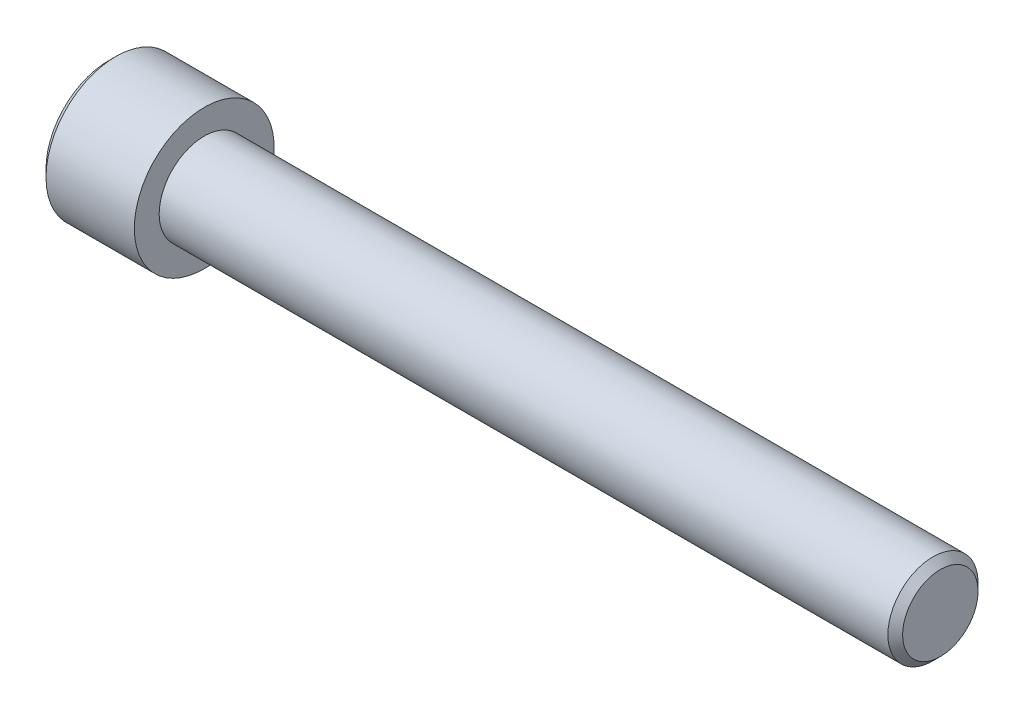
ISO-10303-21;
HEADER;
FILE_DESCRIPTION(('STEP AP214'),'2;1');
FILE_NAME('part.step','',(''),(''),'','','');
FILE_SCHEMA(('AUTOMOTIVE_DESIGN { 1 0 10303 214 1 1 1 1 }'));
ENDSEC;
DATA;
#1=APPLICATION_CONTEXT('core data for automotive mechanical design processes');
#2=APPLICATION_PROTOCOL_DEFINITION('international standard','automotive_design',2000,#1);
#3=PRODUCT_CONTEXT('',#1,'mechanical');
#4=PRODUCT('Part','Part','',(#3));
#5=PRODUCT_RELATED_PRODUCT_CATEGORY('part','',(#4));
#6=PRODUCT_DEFINITION_FORMATION('','',#4);
#7=PRODUCT_DEFINITION_CONTEXT('part definition',#1,'design');
#8=PRODUCT_DEFINITION('design','',#6,#7);
#9=PRODUCT_DEFINITION_SHAPE('','',#8);
#10=(LENGTH_UNIT() NAMED_UNIT(*) SI_UNIT(.MILLI.,.METRE.));
#11=(NAMED_UNIT(*) PLANE_ANGLE_UNIT() SI_UNIT($,.RADIAN.));
#12=(NAMED_UNIT(*) SI_UNIT($,.STERADIAN.) SOLID_ANGLE_UNIT());
#13=UNCERTAINTY_MEASURE_WITH_UNIT(LENGTH_MEASURE(1.E-05),#10,'distance_accuracy_value','');
#14=(GEOMETRIC_REPRESENTATION_CONTEXT(3) GLOBAL_UNCERTAINTY_ASSIGNED_CONTEXT((#13)) GLOBAL_UNIT_ASSIGNED_CONTEXT((#10,
#11,#12)) REPRESENTATION_CONTEXT('',''));
#15=CARTESIAN_POINT('',(0.,0.,0.));
#16=DIRECTION('',(0.,0.,1.));
#17=DIRECTION('',(1.,0.,0.));
#18=AXIS2_PLACEMENT_3D('',#15,#16,#17);
#19=CARTESIAN_POINT('',(28.702,0.,0.));
#20=DIRECTION('',(-1.,0.,0.));
#21=DIRECTION('',(0.,0.,1.));
#22=AXIS2_PLACEMENT_3D('',#19,#20,#21);
#23=PLANE('',#22);
#24=CARTESIAN_POINT('',(28.702,0.,0.));
#25=DIRECTION('',(-1.,0.,0.));
#26=DIRECTION('',(0.,0.,1.));
#27=AXIS2_PLACEMENT_3D('',#24,#25,#26);
#28=CIRCLE('',#27,2.60350000000001);
#29=CARTESIAN_POINT('',(28.702,0.,2.60350000000001));
#30=VERTEX_POINT('',#29);
#31=EDGE_CURVE('E11',#30,#30,#28,.T.);
#32=ORIENTED_EDGE('',*,*,#31,.F.);
#33=EDGE_LOOP('',(#32));
#34=FACE_BOUND('',#33,.T.);
#35=ADVANCED_FACE('F38',(#34),#23,.F.);
#36=CARTESIAN_POINT('',(28.702,0.,0.));
#37=DIRECTION('',(-1.,0.,0.));
#38=DIRECTION('',(0.,0.,1.));
#39=AXIS2_PLACEMENT_3D('',#36,#37,#38);
#40=CONICAL_SURFACE('',#39,2.60350000000001,0.785398163397444);
#41=CARTESIAN_POINT('',(28.194,0.,0.));
#42=DIRECTION('',(-1.,0.,0.));
#43=DIRECTION('',(0.,0.,1.));
#44=AXIS2_PLACEMENT_3D('',#41,#42,#43);
#45=CIRCLE('',#44,3.11150000000002);
#46=CARTESIAN_POINT('',(28.194,0.,3.11150000000002));
#47=VERTEX_POINT('',#46);
#48=EDGE_CURVE('E45',#47,#47,#45,.T.);
#49=ORIENTED_EDGE('',*,*,#48,.F.);
#50=EDGE_LOOP('',(#49));
#51=FACE_BOUND('',#50,.T.);
#52=ORIENTED_EDGE('',*,*,#31,.T.);
#53=EDGE_LOOP('',(#52));
#54=FACE_BOUND('',#53,.T.);
#55=ADVANCED_FACE('F160',(#51,#54),#40,.T.);
#56=CARTESIAN_POINT('',(-40.7590228792785,0.,0.));
#57=DIRECTION('',(-1.,0.,0.));
#58=DIRECTION('',(0.,0.,1.));
#59=AXIS2_PLACEMENT_3D('',#56,#57,#58);
#60=CYLINDRICAL_SURFACE('',#59,3.11150000000002);
#61=CARTESIAN_POINT('',(-22.098,0.,0.));
#62=DIRECTION('',(-1.,0.,0.));
#63=DIRECTION('',(0.,0.,1.));
#64=AXIS2_PLACEMENT_3D('',#61,#62,#63);
#65=CIRCLE('',#64,3.11150000000001);
#66=CARTESIAN_POINT('',(-22.098,0.,3.11150000000001));
#67=VERTEX_POINT('',#66);
#68=EDGE_CURVE('E153',#67,#67,#65,.T.);
#69=ORIENTED_EDGE('',*,*,#68,.F.);
#70=EDGE_LOOP('',(#69));
#71=FACE_BOUND('',#70,.T.);
#72=ORIENTED_EDGE('',*,*,#48,.T.);
#73=EDGE_LOOP('',(#72));
#74=FACE_BOUND('',#73,.T.);
#75=ADVANCED_FACE('F158',(#71,#74),#60,.T.);
#76=CARTESIAN_POINT('',(-22.098,3.11150000000001,0.));
#77=DIRECTION('',(-1.,0.,0.));
#78=DIRECTION('',(0.,0.,1.));
#79=AXIS2_PLACEMENT_3D('',#76,#77,#78);
#80=PLANE('',#79);
#81=CARTESIAN_POINT('',(-22.098,0.,0.));
#82=DIRECTION('',(-1.,0.,0.));
#83=DIRECTION('',(0.,0.,1.));
#84=AXIS2_PLACEMENT_3D('',#81,#82,#83);
#85=CIRCLE('',#84,4.826);
#86=CARTESIAN_POINT('',(-22.098,0.,4.826));
#87=VERTEX_POINT('',#86);
#88=EDGE_CURVE('E150',#87,#87,#85,.T.);
#89=ORIENTED_EDGE('',*,*,#88,.F.);
#90=EDGE_LOOP('',(#89));
#91=FACE_BOUND('',#90,.T.);
#92=ORIENTED_EDGE('',*,*,#68,.T.);
#93=EDGE_LOOP('',(#92));
#94=FACE_BOUND('',#93,.T.);
#95=ADVANCED_FACE('F178',(#91,#94),#80,.F.);
#96=CARTESIAN_POINT('',(-40.7590228792785,0.,0.));
#97=DIRECTION('',(-1.,0.,0.));
#98=DIRECTION('',(0.,0.,1.));
#99=AXIS2_PLACEMENT_3D('',#96,#97,#98);
#100=CYLINDRICAL_SURFACE('',#99,4.826);
#101=CARTESIAN_POINT('',(-28.194,0.,0.));
#102=DIRECTION('',(-1.,0.,0.));
#103=DIRECTION('',(0.,0.,1.));
#104=AXIS2_PLACEMENT_3D('',#101,#102,#103);
#105=CIRCLE('',#104,4.826);
#106=CARTESIAN_POINT('',(-28.194,0.,4.826));
#107=VERTEX_POINT('',#106);
#108=EDGE_CURVE('E147',#107,#107,#105,.T.);
#109=ORIENTED_EDGE('',*,*,#108,.F.);
#110=EDGE_LOOP('',(#109));
#111=FACE_BOUND('',#110,.T.);
#112=ORIENTED_EDGE('',*,*,#88,.T.);
#113=EDGE_LOOP('',(#112));
#114=FACE_BOUND('',#113,.T.);
#115=ADVANCED_FACE('F186',(#111,#114),#100,.T.);
#116=CARTESIAN_POINT('',(-28.194,0.,0.));
#117=DIRECTION('',(1.,0.,0.));
#118=DIRECTION('',(0.,0.,-1.));
#119=AXIS2_PLACEMENT_3D('',#116,#117,#118);
#120=CONICAL_SURFACE('',#119,4.826,0.785398163397447);
#121=CARTESIAN_POINT('',(-28.702,0.,0.));
#122=DIRECTION('',(-1.,0.,0.));
#123=DIRECTION('',(0.,0.,1.));
#124=AXIS2_PLACEMENT_3D('',#121,#122,#123);
#125=CIRCLE('',#124,4.318);
#126=CARTESIAN_POINT('',(-28.702,0.,4.318));
#127=VERTEX_POINT('',#126);
#128=EDGE_CURVE('E139',#127,#127,#125,.T.);
#129=ORIENTED_EDGE('',*,*,#128,.F.);
#130=EDGE_LOOP('',(#129));
#131=FACE_BOUND('',#130,.T.);
#132=ORIENTED_EDGE('',*,*,#108,.T.);
#133=EDGE_LOOP('',(#132));
#134=FACE_BOUND('',#133,.T.);
#135=ADVANCED_FACE('F194',(#131,#134),#120,.T.);
#136=CARTESIAN_POINT('',(-28.702,4.318,0.));
#137=DIRECTION('',(1.,0.,0.));
#138=DIRECTION('',(0.,0.,-1.));
#139=AXIS2_PLACEMENT_3D('',#136,#137,#138);
#140=PLANE('',#139);
#141=DIRECTION('',(0.,-0.5,-0.866025403784439));
#142=VECTOR('',#141,1.);
#143=CARTESIAN_POINT('',(-28.702,2.74963065701561,0.));
#144=LINE('',#143,#142);
#145=CARTESIAN_POINT('',(-28.702,2.74963065701561,0.));
#146=VERTEX_POINT('',#145);
#147=CARTESIAN_POINT('',(-28.702,1.37481532850786,-2.38124999999992));
#148=VERTEX_POINT('',#147);
#149=EDGE_CURVE('E126',#146,#148,#144,.T.);
#150=ORIENTED_EDGE('',*,*,#149,.F.);
#151=DIRECTION('',(0.,0.5,-0.866025403784439));
#152=VECTOR('',#151,1.);
#153=CARTESIAN_POINT('',(-28.702,1.37481532850786,2.38124999999992));
#154=LINE('',#153,#152);
#155=CARTESIAN_POINT('',(-28.702,1.37481532850786,2.38124999999992));
#156=VERTEX_POINT('',#155);
#157=EDGE_CURVE('E52',#156,#146,#154,.T.);
#158=ORIENTED_EDGE('',*,*,#157,.F.);
#159=DIRECTION('',(0.,1.,0.));
#160=VECTOR('',#159,1.);
#161=CARTESIAN_POINT('',(-28.702,-1.37481532850786,2.38124999999992));
#162=LINE('',#161,#160);
#163=CARTESIAN_POINT('',(-28.702,-1.37481532850786,2.38124999999992));
#164=VERTEX_POINT('',#163);
#165=EDGE_CURVE('E135',#164,#156,#162,.T.);
#166=ORIENTED_EDGE('',*,*,#165,.F.);
#167=DIRECTION('',(0.,0.5,0.866025403784439));
#168=VECTOR('',#167,1.);
#169=CARTESIAN_POINT('',(-28.702,-2.74963065701561,0.));
#170=LINE('',#169,#168);
#171=CARTESIAN_POINT('',(-28.702,-2.74963065701561,0.));
#172=VERTEX_POINT('',#171);
#173=EDGE_CURVE('E133',#172,#164,#170,.T.);
#174=ORIENTED_EDGE('',*,*,#173,.F.);
#175=DIRECTION('',(0.,-0.5,0.866025403784439));
#176=VECTOR('',#175,1.);
#177=CARTESIAN_POINT('',(-28.702,-1.37481532850786,-2.38124999999992));
#178=LINE('',#177,#176);
#179=CARTESIAN_POINT('',(-28.702,-1.37481532850786,-2.38124999999992));
#180=VERTEX_POINT('',#179);
#181=EDGE_CURVE('E100',#180,#172,#178,.T.);
#182=ORIENTED_EDGE('',*,*,#181,.F.);
#183=DIRECTION('',(0.,-1.,0.));
#184=VECTOR('',#183,1.);
#185=CARTESIAN_POINT('',(-28.702,1.37481532850786,-2.38124999999992));
#186=LINE('',#185,#184);
#187=EDGE_CURVE('E129',#148,#180,#186,.T.);
#188=ORIENTED_EDGE('',*,*,#187,.F.);
#189=EDGE_LOOP('',(#150,#158,#166,#174,#182,#188));
#190=FACE_BOUND('',#189,.T.);
#191=ORIENTED_EDGE('',*,*,#128,.T.);
#192=EDGE_LOOP('',(#191));
#193=FACE_BOUND('',#192,.T.);
#194=ADVANCED_FACE('F202',(#190,#193),#140,.F.);
#195=CARTESIAN_POINT('',(-24.892,1.37481532850786,2.38124999999992));
#196=DIRECTION('',(0.,0.866025403784439,0.5));
#197=DIRECTION('',(0.,-0.5,0.866025403784439));
#198=AXIS2_PLACEMENT_3D('',#195,#196,#197);
#199=PLANE('',#198);
#200=ORIENTED_EDGE('',*,*,#157,.T.);
#201=DIRECTION('',(-1.,0.,0.));
#202=VECTOR('',#201,1.);
#203=CARTESIAN_POINT('',(-24.892,2.74963065701561,0.));
#204=LINE('',#203,#202);
#205=CARTESIAN_POINT('',(-24.892,2.74963065701561,0.));
#206=VERTEX_POINT('',#205);
#207=EDGE_CURVE('E82',#206,#146,#204,.T.);
#208=ORIENTED_EDGE('',*,*,#207,.F.);
#209=DIRECTION('',(0.,0.5,-0.866025403784439));
#210=VECTOR('',#209,1.);
#211=CARTESIAN_POINT('',(-24.892,1.37481532850786,2.38124999999992));
#212=LINE('',#211,#210);
#213=CARTESIAN_POINT('',(-24.892,1.37481532850786,2.38124999999992));
#214=VERTEX_POINT('',#213);
#215=EDGE_CURVE('E137',#214,#206,#212,.T.);
#216=ORIENTED_EDGE('',*,*,#215,.F.);
#217=DIRECTION('',(-1.,0.,0.));
#218=VECTOR('',#217,1.);
#219=CARTESIAN_POINT('',(-24.892,1.37481532850786,2.38124999999992));
#220=LINE('',#219,#218);
#221=EDGE_CURVE('E60',#214,#156,#220,.T.);
#222=ORIENTED_EDGE('',*,*,#221,.T.);
#223=EDGE_LOOP('',(#200,#208,#216,#222));
#224=FACE_BOUND('',#223,.T.);
#225=ADVANCED_FACE('F210',(#224),#199,.F.);
#226=CARTESIAN_POINT('',(-24.892,-1.37481532850786,2.38124999999992));
#227=DIRECTION('',(0.,0.,1.));
#228=DIRECTION('',(1.,0.,0.));
#229=AXIS2_PLACEMENT_3D('',#226,#227,#228);
#230=PLANE('',#229);
#231=ORIENTED_EDGE('',*,*,#165,.T.);
#232=ORIENTED_EDGE('',*,*,#221,.F.);
#233=DIRECTION('',(0.,1.,0.));
#234=VECTOR('',#233,1.);
#235=CARTESIAN_POINT('',(-24.892,-1.37481532850786,2.38124999999992));
#236=LINE('',#235,#234);
#237=CARTESIAN_POINT('',(-24.892,-1.37481532850786,2.38124999999992));
#238=VERTEX_POINT('',#237);
#239=EDGE_CURVE('E112',#238,#214,#236,.T.);
#240=ORIENTED_EDGE('',*,*,#239,.F.);
#241=DIRECTION('',(-1.,0.,0.));
#242=VECTOR('',#241,1.);
#243=CARTESIAN_POINT('',(-24.892,-1.37481532850786,2.38124999999992));
#244=LINE('',#243,#242);
#245=EDGE_CURVE('E104',#238,#164,#244,.T.);
#246=ORIENTED_EDGE('',*,*,#245,.T.);
#247=EDGE_LOOP('',(#231,#232,#240,#246));
#248=FACE_BOUND('',#247,.T.);
#249=ADVANCED_FACE('F218',(#248),#230,.F.);
#250=CARTESIAN_POINT('',(-24.892,-2.74963065701561,0.));
#251=DIRECTION('',(0.,-0.866025403784439,0.5));
#252=DIRECTION('',(0.,-0.5,-0.866025403784439));
#253=AXIS2_PLACEMENT_3D('',#250,#251,#252);
#254=PLANE('',#253);
#255=ORIENTED_EDGE('',*,*,#173,.T.);
#256=ORIENTED_EDGE('',*,*,#245,.F.);
#257=DIRECTION('',(0.,0.5,0.866025403784439));
#258=VECTOR('',#257,1.);
#259=CARTESIAN_POINT('',(-24.892,-2.74963065701561,0.));
#260=LINE('',#259,#258);
#261=CARTESIAN_POINT('',(-24.892,-2.74963065701561,0.));
#262=VERTEX_POINT('',#261);
#263=EDGE_CURVE('E108',#262,#238,#260,.T.);
#264=ORIENTED_EDGE('',*,*,#263,.F.);
#265=DIRECTION('',(-1.,0.,0.));
#266=VECTOR('',#265,1.);
#267=CARTESIAN_POINT('',(-24.892,-2.74963065701561,0.));
#268=LINE('',#267,#266);
#269=EDGE_CURVE('E93',#262,#172,#268,.T.);
#270=ORIENTED_EDGE('',*,*,#269,.T.);
#271=EDGE_LOOP('',(#255,#256,#264,#270));
#272=FACE_BOUND('',#271,.T.);
#273=ADVANCED_FACE('F109',(#272),#254,.F.);
#274=CARTESIAN_POINT('',(-24.892,-1.37481532850786,-2.38124999999992));
#275=DIRECTION('',(0.,-0.866025403784439,-0.5));
#276=DIRECTION('',(0.,0.5,-0.866025403784439));
#277=AXIS2_PLACEMENT_3D('',#274,#275,#276);
#278=PLANE('',#277);
#279=ORIENTED_EDGE('',*,*,#181,.T.);
#280=ORIENTED_EDGE('',*,*,#269,.F.);
#281=DIRECTION('',(0.,-0.5,0.866025403784439));
#282=VECTOR('',#281,1.);
#283=CARTESIAN_POINT('',(-24.892,-1.37481532850786,-2.38124999999992));
#284=LINE('',#283,#282);
#285=CARTESIAN_POINT('',(-24.892,-1.37481532850786,-2.38124999999992));
#286=VERTEX_POINT('',#285);
#287=EDGE_CURVE('E97',#286,#262,#284,.T.);
#288=ORIENTED_EDGE('',*,*,#287,.F.);
#289=DIRECTION('',(-1.,0.,0.));
#290=VECTOR('',#289,1.);
#291=CARTESIAN_POINT('',(-24.892,-1.37481532850786,-2.38124999999992));
#292=LINE('',#291,#290);
#293=EDGE_CURVE('E105',#286,#180,#292,.T.);
#294=ORIENTED_EDGE('',*,*,#293,.T.);
#295=EDGE_LOOP('',(#279,#280,#288,#294));
#296=FACE_BOUND('',#295,.T.);
#297=ADVANCED_FACE('F95',(#296),#278,.F.);
#298=CARTESIAN_POINT('',(-24.892,1.37481532850786,-2.38124999999992));
#299=DIRECTION('',(0.,0.,-1.));
#300=DIRECTION('',(-1.,0.,0.));
#301=AXIS2_PLACEMENT_3D('',#298,#299,#300);
#302=PLANE('',#301);
#303=ORIENTED_EDGE('',*,*,#187,.T.);
#304=ORIENTED_EDGE('',*,*,#293,.F.);
#305=DIRECTION('',(0.,-1.,0.));
#306=VECTOR('',#305,1.);
#307=CARTESIAN_POINT('',(-24.892,1.37481532850786,-2.38124999999992));
#308=LINE('',#307,#306);
#309=CARTESIAN_POINT('',(-24.892,1.37481532850786,-2.38124999999992));
#310=VERTEX_POINT('',#309);
#311=EDGE_CURVE('E118',#310,#286,#308,.T.);
#312=ORIENTED_EDGE('',*,*,#311,.F.);
#313=DIRECTION('',(-1.,0.,0.));
#314=VECTOR('',#313,1.);
#315=CARTESIAN_POINT('',(-24.892,1.37481532850786,-2.38124999999992));
#316=LINE('',#315,#314);
#317=EDGE_CURVE('E142',#310,#148,#316,.T.);
#318=ORIENTED_EDGE('',*,*,#317,.T.);
#319=EDGE_LOOP('',(#303,#304,#312,#318));
#320=FACE_BOUND('',#319,.T.);
#321=ADVANCED_FACE('F237',(#320),#302,.F.);
#322=CARTESIAN_POINT('',(-24.892,2.74963065701561,0.));
#323=DIRECTION('',(0.,0.866025403784439,-0.5));
#324=DIRECTION('',(0.,0.5,0.866025403784439));
#325=AXIS2_PLACEMENT_3D('',#322,#323,#324);
#326=PLANE('',#325);
#327=ORIENTED_EDGE('',*,*,#149,.T.);
#328=ORIENTED_EDGE('',*,*,#317,.F.);
#329=DIRECTION('',(0.,-0.5,-0.866025403784439));
#330=VECTOR('',#329,1.);
#331=CARTESIAN_POINT('',(-24.892,2.74963065701561,0.));
#332=LINE('',#331,#330);
#333=EDGE_CURVE('E120',#206,#310,#332,.T.);
#334=ORIENTED_EDGE('',*,*,#333,.F.);
#335=ORIENTED_EDGE('',*,*,#207,.T.);
#336=EDGE_LOOP('',(#327,#328,#334,#335));
#337=FACE_BOUND('',#336,.T.);
#338=ADVANCED_FACE('F244',(#337),#326,.F.);
#339=CARTESIAN_POINT('',(-24.892,2.74963065701561,0.));
#340=DIRECTION('',(-1.,0.,0.));
#341=DIRECTION('',(0.,0.,1.));
#342=AXIS2_PLACEMENT_3D('',#339,#340,#341);
#343=PLANE('',#342);
#344=ORIENTED_EDGE('',*,*,#215,.T.);
#345=ORIENTED_EDGE('',*,*,#333,.T.);
#346=ORIENTED_EDGE('',*,*,#311,.T.);
#347=ORIENTED_EDGE('',*,*,#287,.T.);
#348=ORIENTED_EDGE('',*,*,#263,.T.);
#349=ORIENTED_EDGE('',*,*,#239,.T.);
#350=EDGE_LOOP('',(#344,#345,#346,#347,#348,#349));
#351=FACE_BOUND('',#350,.T.);
#352=ADVANCED_FACE('F115',(#351),#343,.T.);
#353=CLOSED_SHELL('',(#35,#55,#75,#95,#115,#135,#194,#225,#249,#273,#297,#321,#338,#352));
#354=MANIFOLD_SOLID_BREP('B2',#353);
#355=ADVANCED_BREP_SHAPE_REPRESENTATION('',(#18,#354),#14);
#356=SHAPE_DEFINITION_REPRESENTATION(#9,#355);
ENDSEC;
END-ISO-10303-21;
